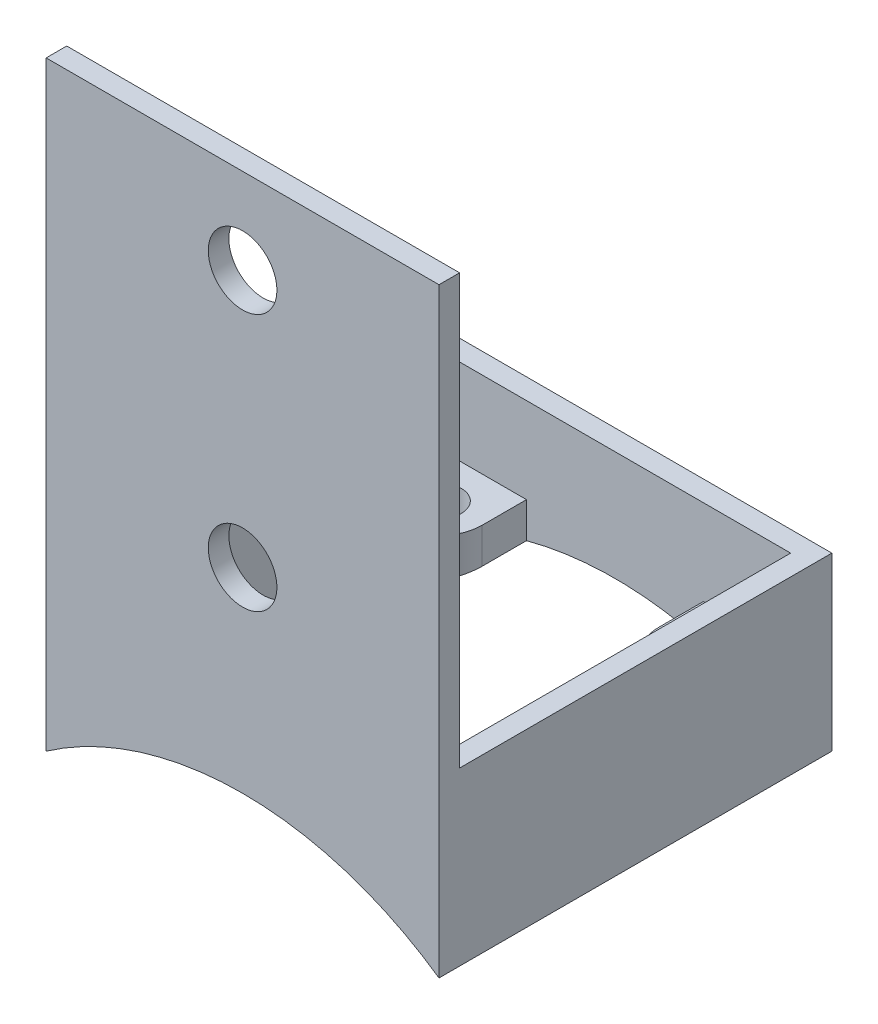
ISO-10303-21;
HEADER;
FILE_DESCRIPTION(('STEP AP214'),'2;1');
FILE_NAME('part.step','',(''),(''),'','','');
FILE_SCHEMA(('AUTOMOTIVE_DESIGN { 1 0 10303 214 1 1 1 1 }'));
ENDSEC;
DATA;
#1=APPLICATION_CONTEXT('core data for automotive mechanical design processes');
#2=APPLICATION_PROTOCOL_DEFINITION('international standard','automotive_design',2000,#1);
#3=PRODUCT_CONTEXT('',#1,'mechanical');
#4=PRODUCT('Part','Part','',(#3));
#5=PRODUCT_RELATED_PRODUCT_CATEGORY('part','',(#4));
#6=PRODUCT_DEFINITION_FORMATION('','',#4);
#7=PRODUCT_DEFINITION_CONTEXT('part definition',#1,'design');
#8=PRODUCT_DEFINITION('design','',#6,#7);
#9=PRODUCT_DEFINITION_SHAPE('','',#8);
#10=(LENGTH_UNIT() NAMED_UNIT(*) SI_UNIT(.MILLI.,.METRE.));
#11=(NAMED_UNIT(*) PLANE_ANGLE_UNIT() SI_UNIT($,.RADIAN.));
#12=(NAMED_UNIT(*) SI_UNIT($,.STERADIAN.) SOLID_ANGLE_UNIT());
#13=UNCERTAINTY_MEASURE_WITH_UNIT(LENGTH_MEASURE(1.E-05),#10,'distance_accuracy_value','');
#14=(GEOMETRIC_REPRESENTATION_CONTEXT(3) GLOBAL_UNCERTAINTY_ASSIGNED_CONTEXT((#13)) GLOBAL_UNIT_ASSIGNED_CONTEXT((#10,
#11,#12)) REPRESENTATION_CONTEXT('',''));
#15=CARTESIAN_POINT('',(0.,0.,0.));
#16=DIRECTION('',(0.,0.,1.));
#17=DIRECTION('',(1.,0.,0.));
#18=AXIS2_PLACEMENT_3D('',#15,#16,#17);
#19=CARTESIAN_POINT('',(10.25,10.,0.));
#20=DIRECTION('',(1.,0.,0.));
#21=DIRECTION('',(0.,0.,-1.));
#22=AXIS2_PLACEMENT_3D('',#19,#20,#21);
#23=PLANE('',#22);
#24=DIRECTION('',(0.,-1.,0.));
#25=VECTOR('',#24,1.);
#26=CARTESIAN_POINT('',(10.25,5.,-5.17999999999993));
#27=LINE('',#26,#25);
#28=CARTESIAN_POINT('',(10.25,5.,-5.17999999999993));
#29=VERTEX_POINT('',#28);
#30=CARTESIAN_POINT('',(10.25,0.775650094111034,-5.17999999999994));
#31=VERTEX_POINT('',#30);
#32=EDGE_CURVE('E283',#29,#31,#27,.T.);
#33=ORIENTED_EDGE('',*,*,#32,.T.);
#34=DIRECTION('',(0.,0.,-1.));
#35=VECTOR('',#34,1.);
#36=CARTESIAN_POINT('',(10.25,0.775650094111034,11.451));
#37=LINE('',#36,#35);
#38=CARTESIAN_POINT('',(10.25,0.775650094111034,10.25));
#39=VERTEX_POINT('',#38);
#40=EDGE_CURVE('E242',#39,#31,#37,.T.);
#41=ORIENTED_EDGE('',*,*,#40,.F.);
#42=DIRECTION('',(0.,-1.,0.));
#43=VECTOR('',#42,1.);
#44=CARTESIAN_POINT('',(10.25,10.,10.25));
#45=LINE('',#44,#43);
#46=CARTESIAN_POINT('',(10.25,10.,10.25));
#47=VERTEX_POINT('',#46);
#48=EDGE_CURVE('E45',#47,#39,#45,.T.);
#49=ORIENTED_EDGE('',*,*,#48,.F.);
#50=DIRECTION('',(0.,0.,1.));
#51=VECTOR('',#50,1.);
#52=CARTESIAN_POINT('',(10.25,10.,0.));
#53=LINE('',#52,#51);
#54=CARTESIAN_POINT('',(10.25,10.,-10.25));
#55=VERTEX_POINT('',#54);
#56=EDGE_CURVE('E219',#55,#47,#53,.T.);
#57=ORIENTED_EDGE('',*,*,#56,.F.);
#58=DIRECTION('',(0.,-1.,0.));
#59=VECTOR('',#58,1.);
#60=CARTESIAN_POINT('',(10.25,10.,-10.25));
#61=LINE('',#60,#59);
#62=CARTESIAN_POINT('',(10.25,5.,-10.25));
#63=VERTEX_POINT('',#62);
#64=EDGE_CURVE('E197',#55,#63,#61,.T.);
#65=ORIENTED_EDGE('',*,*,#64,.T.);
#66=DIRECTION('',(0.,0.,1.));
#67=VECTOR('',#66,1.);
#68=CARTESIAN_POINT('',(10.25,5.,0.));
#69=LINE('',#68,#67);
#70=EDGE_CURVE('E268',#63,#29,#69,.T.);
#71=ORIENTED_EDGE('',*,*,#70,.T.);
#72=EDGE_LOOP('',(#33,#41,#49,#57,#65,#71));
#73=FACE_BOUND('',#72,.T.);
#74=ADVANCED_FACE('F36',(#73),#23,.F.);
#75=CARTESIAN_POINT('',(0.,10.,-10.25));
#76=DIRECTION('',(0.,0.,-1.));
#77=DIRECTION('',(-1.,0.,0.));
#78=AXIS2_PLACEMENT_3D('',#75,#76,#77);
#79=PLANE('',#78);
#80=DIRECTION('',(0.,-1.,0.));
#81=VECTOR('',#80,1.);
#82=CARTESIAN_POINT('',(-5.15,5.,-10.25));
#83=LINE('',#82,#81);
#84=CARTESIAN_POINT('',(-5.15,5.,-10.25));
#85=VERTEX_POINT('',#84);
#86=CARTESIAN_POINT('',(-5.15,2.92747156694182,-10.25));
#87=VERTEX_POINT('',#86);
#88=EDGE_CURVE('E307',#85,#87,#83,.T.);
#89=ORIENTED_EDGE('',*,*,#88,.T.);
#90=CARTESIAN_POINT('',(0.,-16.3980944014846,-10.25));
#91=DIRECTION('',(0.,0.,-1.));
#92=DIRECTION('',(-1.,0.,0.));
#93=AXIS2_PLACEMENT_3D('',#90,#91,#92);
#94=CIRCLE('',#93,20.);
#95=CARTESIAN_POINT('',(5.14999999999993,2.9274715669418,-10.25));
#96=VERTEX_POINT('',#95);
#97=EDGE_CURVE('E618',#96,#87,#94,.F.);
#98=ORIENTED_EDGE('',*,*,#97,.F.);
#99=DIRECTION('',(0.,-1.,0.));
#100=VECTOR('',#99,1.);
#101=CARTESIAN_POINT('',(5.14999999999993,5.,-10.25));
#102=LINE('',#101,#100);
#103=CARTESIAN_POINT('',(5.14999999999993,5.,-10.25));
#104=VERTEX_POINT('',#103);
#105=EDGE_CURVE('E280',#104,#96,#102,.T.);
#106=ORIENTED_EDGE('',*,*,#105,.F.);
#107=DIRECTION('',(1.,0.,0.));
#108=VECTOR('',#107,1.);
#109=CARTESIAN_POINT('',(0.,5.,-10.25));
#110=LINE('',#109,#108);
#111=EDGE_CURVE('E237',#104,#63,#110,.T.);
#112=ORIENTED_EDGE('',*,*,#111,.T.);
#113=ORIENTED_EDGE('',*,*,#64,.F.);
#114=DIRECTION('',(1.,0.,0.));
#115=VECTOR('',#114,1.);
#116=CARTESIAN_POINT('',(0.,10.,-10.25));
#117=LINE('',#116,#115);
#118=CARTESIAN_POINT('',(-10.25,10.,-10.25));
#119=VERTEX_POINT('',#118);
#120=EDGE_CURVE('E194',#119,#55,#117,.T.);
#121=ORIENTED_EDGE('',*,*,#120,.F.);
#122=DIRECTION('',(0.,-1.,0.));
#123=VECTOR('',#122,1.);
#124=CARTESIAN_POINT('',(-10.25,10.,-10.25));
#125=LINE('',#124,#123);
#126=CARTESIAN_POINT('',(-10.25,5.,-10.25));
#127=VERTEX_POINT('',#126);
#128=EDGE_CURVE('E200',#119,#127,#125,.T.);
#129=ORIENTED_EDGE('',*,*,#128,.T.);
#130=DIRECTION('',(1.,0.,0.));
#131=VECTOR('',#130,1.);
#132=CARTESIAN_POINT('',(0.,5.,-10.25));
#133=LINE('',#132,#131);
#134=EDGE_CURVE('E299',#127,#85,#133,.T.);
#135=ORIENTED_EDGE('',*,*,#134,.T.);
#136=EDGE_LOOP('',(#89,#98,#106,#112,#113,#121,#129,#135));
#137=FACE_BOUND('',#136,.T.);
#138=ADVANCED_FACE('F235',(#137),#79,.F.);
#139=CARTESIAN_POINT('',(0.,10.,10.25));
#140=DIRECTION('',(0.,0.,-1.));
#141=DIRECTION('',(-1.,0.,0.));
#142=AXIS2_PLACEMENT_3D('',#139,#140,#141);
#143=PLANE('',#142);
#144=CARTESIAN_POINT('',(0.,15.,10.25));
#145=DIRECTION('',(0.,0.,-1.));
#146=DIRECTION('',(-1.,0.,0.));
#147=AXIS2_PLACEMENT_3D('',#144,#145,#146);
#148=CIRCLE('',#147,2.);
#149=CARTESIAN_POINT('',(-2.,15.,10.25));
#150=VERTEX_POINT('',#149);
#151=EDGE_CURVE('E594',#150,#150,#148,.T.);
#152=ORIENTED_EDGE('',*,*,#151,.F.);
#153=EDGE_LOOP('',(#152));
#154=FACE_BOUND('',#153,.T.);
#155=CARTESIAN_POINT('',(0.,30.,10.25));
#156=DIRECTION('',(0.,0.,-1.));
#157=DIRECTION('',(-1.,0.,0.));
#158=AXIS2_PLACEMENT_3D('',#155,#156,#157);
#159=CIRCLE('',#158,2.);
#160=CARTESIAN_POINT('',(-2.,30.,10.25));
#161=VERTEX_POINT('',#160);
#162=EDGE_CURVE('E597',#161,#161,#159,.T.);
#163=ORIENTED_EDGE('',*,*,#162,.F.);
#164=EDGE_LOOP('',(#163));
#165=FACE_BOUND('',#164,.T.);
#166=CARTESIAN_POINT('',(0.,-16.3980944014846,10.25));
#167=DIRECTION('',(0.,0.,-1.));
#168=DIRECTION('',(-1.,0.,0.));
#169=AXIS2_PLACEMENT_3D('',#166,#167,#168);
#170=CIRCLE('',#169,20.);
#171=CARTESIAN_POINT('',(-10.25,0.775650094111038,10.25));
#172=VERTEX_POINT('',#171);
#173=EDGE_CURVE('E631',#39,#172,#170,.F.);
#174=ORIENTED_EDGE('',*,*,#173,.T.);
#175=DIRECTION('',(0.,-1.,0.));
#176=VECTOR('',#175,1.);
#177=CARTESIAN_POINT('',(-10.25,10.,10.25));
#178=LINE('',#177,#176);
#179=CARTESIAN_POINT('',(-10.25,10.,10.25));
#180=VERTEX_POINT('',#179);
#181=EDGE_CURVE('E203',#180,#172,#178,.T.);
#182=ORIENTED_EDGE('',*,*,#181,.F.);
#183=DIRECTION('',(-1.,0.,0.));
#184=VECTOR('',#183,1.);
#185=CARTESIAN_POINT('',(-11.45,10.,10.25));
#186=LINE('',#185,#184);
#187=CARTESIAN_POINT('',(-11.45,10.,10.25));
#188=VERTEX_POINT('',#187);
#189=EDGE_CURVE('E11',#180,#188,#186,.T.);
#190=ORIENTED_EDGE('',*,*,#189,.T.);
#191=DIRECTION('',(0.,-1.,0.));
#192=VECTOR('',#191,1.);
#193=CARTESIAN_POINT('',(-11.45,35.,10.25));
#194=LINE('',#193,#192);
#195=CARTESIAN_POINT('',(-11.45,35.,10.25));
#196=VERTEX_POINT('',#195);
#197=EDGE_CURVE('E218',#196,#188,#194,.T.);
#198=ORIENTED_EDGE('',*,*,#197,.F.);
#199=DIRECTION('',(-1.,0.,0.));
#200=VECTOR('',#199,1.);
#201=CARTESIAN_POINT('',(-11.45,35.,10.25));
#202=LINE('',#201,#200);
#203=CARTESIAN_POINT('',(11.45,35.,10.25));
#204=VERTEX_POINT('',#203);
#205=EDGE_CURVE('E258',#204,#196,#202,.T.);
#206=ORIENTED_EDGE('',*,*,#205,.F.);
#207=DIRECTION('',(0.,-1.,0.));
#208=VECTOR('',#207,1.);
#209=CARTESIAN_POINT('',(11.45,35.,10.25));
#210=LINE('',#209,#208);
#211=CARTESIAN_POINT('',(11.45,10.,10.25));
#212=VERTEX_POINT('',#211);
#213=EDGE_CURVE('E249',#204,#212,#210,.T.);
#214=ORIENTED_EDGE('',*,*,#213,.T.);
#215=EDGE_CURVE('E47',#212,#47,#186,.T.);
#216=ORIENTED_EDGE('',*,*,#215,.T.);
#217=ORIENTED_EDGE('',*,*,#48,.T.);
#218=EDGE_LOOP('',(#174,#182,#190,#198,#206,#214,#216,#217));
#219=FACE_BOUND('',#218,.T.);
#220=ADVANCED_FACE('F246',(#154,#165,#219),#143,.T.);
#221=CARTESIAN_POINT('',(-10.25,10.,0.));
#222=DIRECTION('',(1.,0.,0.));
#223=DIRECTION('',(0.,0.,-1.));
#224=AXIS2_PLACEMENT_3D('',#221,#222,#223);
#225=PLANE('',#224);
#226=DIRECTION('',(0.,0.,-1.));
#227=VECTOR('',#226,1.);
#228=CARTESIAN_POINT('',(-10.25,0.775650094111038,11.451));
#229=LINE('',#228,#227);
#230=CARTESIAN_POINT('',(-10.25,0.775650094111034,-5.17999999999994));
#231=VERTEX_POINT('',#230);
#232=EDGE_CURVE('E325',#172,#231,#229,.T.);
#233=ORIENTED_EDGE('',*,*,#232,.T.);
#234=DIRECTION('',(0.,-1.,0.));
#235=VECTOR('',#234,1.);
#236=CARTESIAN_POINT('',(-10.25,5.,-5.17999999999993));
#237=LINE('',#236,#235);
#238=CARTESIAN_POINT('',(-10.25,5.,-5.17999999999993));
#239=VERTEX_POINT('',#238);
#240=EDGE_CURVE('E304',#239,#231,#237,.T.);
#241=ORIENTED_EDGE('',*,*,#240,.F.);
#242=DIRECTION('',(0.,0.,1.));
#243=VECTOR('',#242,1.);
#244=CARTESIAN_POINT('',(-10.25,5.,0.));
#245=LINE('',#244,#243);
#246=EDGE_CURVE('E302',#127,#239,#245,.T.);
#247=ORIENTED_EDGE('',*,*,#246,.F.);
#248=ORIENTED_EDGE('',*,*,#128,.F.);
#249=DIRECTION('',(0.,0.,1.));
#250=VECTOR('',#249,1.);
#251=CARTESIAN_POINT('',(-10.25,10.,0.));
#252=LINE('',#251,#250);
#253=EDGE_CURVE('E225',#119,#180,#252,.T.);
#254=ORIENTED_EDGE('',*,*,#253,.T.);
#255=ORIENTED_EDGE('',*,*,#181,.T.);
#256=EDGE_LOOP('',(#233,#241,#247,#248,#254,#255));
#257=FACE_BOUND('',#256,.T.);
#258=ADVANCED_FACE('F362',(#257),#225,.T.);
#259=CARTESIAN_POINT('',(0.,10.,11.45));
#260=DIRECTION('',(0.,0.,-1.));
#261=DIRECTION('',(-1.,0.,0.));
#262=AXIS2_PLACEMENT_3D('',#259,#260,#261);
#263=PLANE('',#262);
#264=CARTESIAN_POINT('',(0.,15.,11.45));
#265=DIRECTION('',(0.,0.,-1.));
#266=DIRECTION('',(-1.,0.,0.));
#267=AXIS2_PLACEMENT_3D('',#264,#265,#266);
#268=CIRCLE('',#267,2.);
#269=CARTESIAN_POINT('',(-2.,15.,11.45));
#270=VERTEX_POINT('',#269);
#271=EDGE_CURVE('E351',#270,#270,#268,.T.);
#272=ORIENTED_EDGE('',*,*,#271,.T.);
#273=EDGE_LOOP('',(#272));
#274=FACE_BOUND('',#273,.T.);
#275=CARTESIAN_POINT('',(0.,30.,11.45));
#276=DIRECTION('',(0.,0.,-1.));
#277=DIRECTION('',(-1.,0.,0.));
#278=AXIS2_PLACEMENT_3D('',#275,#276,#277);
#279=CIRCLE('',#278,2.);
#280=CARTESIAN_POINT('',(-2.,30.,11.45));
#281=VERTEX_POINT('',#280);
#282=EDGE_CURVE('E599',#281,#281,#279,.T.);
#283=ORIENTED_EDGE('',*,*,#282,.T.);
#284=EDGE_LOOP('',(#283));
#285=FACE_BOUND('',#284,.T.);
#286=DIRECTION('',(0.,-1.,0.));
#287=VECTOR('',#286,1.);
#288=CARTESIAN_POINT('',(-11.45,10.,11.45));
#289=LINE('',#288,#287);
#290=CARTESIAN_POINT('',(-11.45,35.,11.45));
#291=VERTEX_POINT('',#290);
#292=CARTESIAN_POINT('',(-11.45,0.,11.45));
#293=VERTEX_POINT('',#292);
#294=EDGE_CURVE('E208',#291,#293,#289,.T.);
#295=ORIENTED_EDGE('',*,*,#294,.T.);
#296=CARTESIAN_POINT('',(0.,-16.3980944014846,11.45));
#297=DIRECTION('',(0.,0.,-1.));
#298=DIRECTION('',(-1.,0.,0.));
#299=AXIS2_PLACEMENT_3D('',#296,#297,#298);
#300=CIRCLE('',#299,20.);
#301=CARTESIAN_POINT('',(11.45,0.,11.45));
#302=VERTEX_POINT('',#301);
#303=EDGE_CURVE('E251',#302,#293,#300,.F.);
#304=ORIENTED_EDGE('',*,*,#303,.F.);
#305=DIRECTION('',(0.,-1.,0.));
#306=VECTOR('',#305,1.);
#307=CARTESIAN_POINT('',(11.45,10.,11.45));
#308=LINE('',#307,#306);
#309=CARTESIAN_POINT('',(11.45,35.,11.45));
#310=VERTEX_POINT('',#309);
#311=EDGE_CURVE('E40',#310,#302,#308,.T.);
#312=ORIENTED_EDGE('',*,*,#311,.F.);
#313=DIRECTION('',(1.,0.,0.));
#314=VECTOR('',#313,1.);
#315=CARTESIAN_POINT('',(-11.45,35.,11.45));
#316=LINE('',#315,#314);
#317=EDGE_CURVE('E253',#291,#310,#316,.T.);
#318=ORIENTED_EDGE('',*,*,#317,.F.);
#319=EDGE_LOOP('',(#295,#304,#312,#318));
#320=FACE_BOUND('',#319,.T.);
#321=ADVANCED_FACE('F38',(#274,#285,#320),#263,.F.);
#322=CARTESIAN_POINT('',(11.45,10.,0.));
#323=DIRECTION('',(1.,0.,0.));
#324=DIRECTION('',(0.,0.,-1.));
#325=AXIS2_PLACEMENT_3D('',#322,#323,#324);
#326=PLANE('',#325);
#327=DIRECTION('',(0.,0.,1.));
#328=VECTOR('',#327,1.);
#329=CARTESIAN_POINT('',(11.45,10.,0.));
#330=LINE('',#329,#328);
#331=CARTESIAN_POINT('',(11.45,10.,-11.45));
#332=VERTEX_POINT('',#331);
#333=EDGE_CURVE('E188',#332,#212,#330,.T.);
#334=ORIENTED_EDGE('',*,*,#333,.T.);
#335=ORIENTED_EDGE('',*,*,#213,.F.);
#336=DIRECTION('',(0.,0.,-1.));
#337=VECTOR('',#336,1.);
#338=CARTESIAN_POINT('',(11.45,35.,10.25));
#339=LINE('',#338,#337);
#340=EDGE_CURVE('E355',#310,#204,#339,.T.);
#341=ORIENTED_EDGE('',*,*,#340,.F.);
#342=ORIENTED_EDGE('',*,*,#311,.T.);
#343=DIRECTION('',(0.,0.,1.));
#344=VECTOR('',#343,1.);
#345=CARTESIAN_POINT('',(11.45,0.,0.));
#346=LINE('',#345,#344);
#347=CARTESIAN_POINT('',(11.45,0.,-11.45));
#348=VERTEX_POINT('',#347);
#349=EDGE_CURVE('E167',#348,#302,#346,.T.);
#350=ORIENTED_EDGE('',*,*,#349,.F.);
#351=DIRECTION('',(0.,-1.,0.));
#352=VECTOR('',#351,1.);
#353=CARTESIAN_POINT('',(11.45,10.,-11.45));
#354=LINE('',#353,#352);
#355=EDGE_CURVE('E177',#332,#348,#354,.T.);
#356=ORIENTED_EDGE('',*,*,#355,.F.);
#357=EDGE_LOOP('',(#334,#335,#341,#342,#350,#356));
#358=FACE_BOUND('',#357,.T.);
#359=ADVANCED_FACE('F184',(#358),#326,.T.);
#360=CARTESIAN_POINT('',(0.,10.,-11.45));
#361=DIRECTION('',(0.,0.,-1.));
#362=DIRECTION('',(-1.,0.,0.));
#363=AXIS2_PLACEMENT_3D('',#360,#361,#362);
#364=PLANE('',#363);
#365=CARTESIAN_POINT('',(0.,-16.3980944014846,-11.45));
#366=DIRECTION('',(0.,0.,-1.));
#367=DIRECTION('',(-1.,0.,0.));
#368=AXIS2_PLACEMENT_3D('',#365,#366,#367);
#369=CIRCLE('',#368,20.);
#370=CARTESIAN_POINT('',(-11.45,0.,-11.45));
#371=VERTEX_POINT('',#370);
#372=EDGE_CURVE('E163',#371,#348,#369,.T.);
#373=ORIENTED_EDGE('',*,*,#372,.F.);
#374=DIRECTION('',(0.,-1.,0.));
#375=VECTOR('',#374,1.);
#376=CARTESIAN_POINT('',(-11.45,10.,-11.45));
#377=LINE('',#376,#375);
#378=CARTESIAN_POINT('',(-11.45,10.,-11.45));
#379=VERTEX_POINT('',#378);
#380=EDGE_CURVE('E182',#379,#371,#377,.T.);
#381=ORIENTED_EDGE('',*,*,#380,.F.);
#382=DIRECTION('',(1.,0.,0.));
#383=VECTOR('',#382,1.);
#384=CARTESIAN_POINT('',(0.,10.,-11.45));
#385=LINE('',#384,#383);
#386=EDGE_CURVE('E180',#379,#332,#385,.T.);
#387=ORIENTED_EDGE('',*,*,#386,.T.);
#388=ORIENTED_EDGE('',*,*,#355,.T.);
#389=EDGE_LOOP('',(#373,#381,#387,#388));
#390=FACE_BOUND('',#389,.T.);
#391=ADVANCED_FACE('F178',(#390),#364,.T.);
#392=CARTESIAN_POINT('',(-11.45,10.,0.));
#393=DIRECTION('',(1.,0.,0.));
#394=DIRECTION('',(0.,0.,-1.));
#395=AXIS2_PLACEMENT_3D('',#392,#393,#394);
#396=PLANE('',#395);
#397=DIRECTION('',(0.,0.,1.));
#398=VECTOR('',#397,1.);
#399=CARTESIAN_POINT('',(-11.45,0.,0.));
#400=LINE('',#399,#398);
#401=EDGE_CURVE('E170',#371,#293,#400,.T.);
#402=ORIENTED_EDGE('',*,*,#401,.T.);
#403=ORIENTED_EDGE('',*,*,#294,.F.);
#404=DIRECTION('',(0.,0.,1.));
#405=VECTOR('',#404,1.);
#406=CARTESIAN_POINT('',(-11.45,35.,10.25));
#407=LINE('',#406,#405);
#408=EDGE_CURVE('E250',#196,#291,#407,.T.);
#409=ORIENTED_EDGE('',*,*,#408,.F.);
#410=ORIENTED_EDGE('',*,*,#197,.T.);
#411=DIRECTION('',(0.,0.,1.));
#412=VECTOR('',#411,1.);
#413=CARTESIAN_POINT('',(-11.45,10.,0.));
#414=LINE('',#413,#412);
#415=EDGE_CURVE('E215',#379,#188,#414,.T.);
#416=ORIENTED_EDGE('',*,*,#415,.F.);
#417=ORIENTED_EDGE('',*,*,#380,.T.);
#418=EDGE_LOOP('',(#402,#403,#409,#410,#416,#417));
#419=FACE_BOUND('',#418,.T.);
#420=ADVANCED_FACE('F213',(#419),#396,.F.);
#421=CARTESIAN_POINT('',(0.,10.,0.));
#422=DIRECTION('',(0.,1.,0.));
#423=DIRECTION('',(0.,0.,1.));
#424=AXIS2_PLACEMENT_3D('',#421,#422,#423);
#425=PLANE('',#424);
#426=ORIENTED_EDGE('',*,*,#215,.F.);
#427=ORIENTED_EDGE('',*,*,#333,.F.);
#428=ORIENTED_EDGE('',*,*,#386,.F.);
#429=ORIENTED_EDGE('',*,*,#415,.T.);
#430=ORIENTED_EDGE('',*,*,#189,.F.);
#431=ORIENTED_EDGE('',*,*,#253,.F.);
#432=ORIENTED_EDGE('',*,*,#120,.T.);
#433=ORIENTED_EDGE('',*,*,#56,.T.);
#434=EDGE_LOOP('',(#426,#427,#428,#429,#430,#431,#432,#433));
#435=FACE_BOUND('',#434,.T.);
#436=ADVANCED_FACE('F221',(#435),#425,.T.);
#437=CARTESIAN_POINT('',(0.,5.,-5.17999999999993));
#438=DIRECTION('',(0.,0.,1.));
#439=DIRECTION('',(1.,0.,0.));
#440=AXIS2_PLACEMENT_3D('',#437,#438,#439);
#441=PLANE('',#440);
#442=CARTESIAN_POINT('',(0.,-16.3980944014846,-5.17999999999994));
#443=DIRECTION('',(0.,0.,1.));
#444=DIRECTION('',(1.,0.,0.));
#445=AXIS2_PLACEMENT_3D('',#442,#443,#444);
#446=CIRCLE('',#445,20.);
#447=CARTESIAN_POINT('',(-7.62,2.09340634886018,-5.17999999999993));
#448=VERTEX_POINT('',#447);
#449=EDGE_CURVE('E323',#231,#448,#446,.F.);
#450=ORIENTED_EDGE('',*,*,#449,.T.);
#451=DIRECTION('',(0.,-1.,0.));
#452=VECTOR('',#451,1.);
#453=CARTESIAN_POINT('',(-7.62,5.,-5.17999999999993));
#454=LINE('',#453,#452);
#455=CARTESIAN_POINT('',(-7.62,5.,-5.17999999999993));
#456=VERTEX_POINT('',#455);
#457=EDGE_CURVE('E186',#456,#448,#454,.T.);
#458=ORIENTED_EDGE('',*,*,#457,.F.);
#459=DIRECTION('',(-1.,0.,0.));
#460=VECTOR('',#459,1.);
#461=CARTESIAN_POINT('',(0.,5.,-5.17999999999993));
#462=LINE('',#461,#460);
#463=EDGE_CURVE('E291',#456,#239,#462,.T.);
#464=ORIENTED_EDGE('',*,*,#463,.T.);
#465=ORIENTED_EDGE('',*,*,#240,.T.);
#466=EDGE_LOOP('',(#450,#458,#464,#465));
#467=FACE_BOUND('',#466,.T.);
#468=ADVANCED_FACE('F397',(#467),#441,.T.);
#469=CARTESIAN_POINT('',(-7.62,5.,-7.64999999999993));
#470=DIRECTION('',(0.,-1.,0.));
#471=DIRECTION('',(0.,0.,-1.));
#472=AXIS2_PLACEMENT_3D('',#469,#470,#471);
#473=CYLINDRICAL_SURFACE('',#472,2.47);
#474=ORIENTED_EDGE('',*,*,#457,.T.);
#475=CARTESIAN_POINT('',(-5.15,2.92747156694182,-7.64999999999993));
#476=CARTESIAN_POINT('',(-5.14999223558399,2.92747097260264,-7.58247948906051));
#477=CARTESIAN_POINT('',(-5.15276855248304,2.92673371624351,-7.514962452327));
#478=CARTESIAN_POINT('',(-5.16382977522235,2.9237823720544,-7.38041923995242));
#479=CARTESIAN_POINT('',(-5.17211420936993,2.92156841068337,-7.31339302277643));
#480=CARTESIAN_POINT('',(-5.19411670710465,2.91566428386935,-7.18039675118935));
#481=CARTESIAN_POINT('',(-5.20782715122338,2.91197618840545,-7.11442535013461));
#482=CARTESIAN_POINT('',(-5.24054955511454,2.90312123693403,-6.98393151999905));
#483=CARTESIAN_POINT('',(-5.25956148358291,2.89795438965819,-6.91940908236487));
#484=CARTESIAN_POINT('',(-5.3243477830406,2.88021871576205,-6.72865851647103));
#485=CARTESIAN_POINT('',(-5.37788587042126,2.86541132037174,-6.60516812217229));
#486=CARTESIAN_POINT('',(-5.50377080002298,2.82982162368435,-6.36922584477822));
#487=CARTESIAN_POINT('',(-5.57611740068517,2.80903939912199,-6.25677381994199));
#488=CARTESIAN_POINT('',(-5.73798934559608,2.76130654854392,-6.04473263800879));
#489=CARTESIAN_POINT('',(-5.82767102353969,2.73429932072138,-5.94527550900525));
#490=CARTESIAN_POINT('',(-6.02080272504163,2.67440252955053,-5.76290744558526));
#491=CARTESIAN_POINT('',(-6.12425394921658,2.64151245316925,-5.67999795559488));
#492=CARTESIAN_POINT('',(-6.34504988447819,2.56909383232979,-5.530153735974));
#493=CARTESIAN_POINT('',(-6.46272448899574,2.5293919552003,-5.46378999426301));
#494=CARTESIAN_POINT('',(-6.70572857344134,2.44467002190433,-5.35153685144533));
#495=CARTESIAN_POINT('',(-6.83106168845243,2.39964743066173,-5.30565726024036));
#496=CARTESIAN_POINT('',(-7.06713184792431,2.31203795246037,-5.24002598106749));
#497=CARTESIAN_POINT('',(-7.17732058462541,2.27005891712165,-5.21743312821896));
#498=CARTESIAN_POINT('',(-7.39849039126159,2.18352722446204,-5.18742102553309));
#499=CARTESIAN_POINT('',(-7.50946935780649,2.13898005484746,-5.1799705705591));
#500=CARTESIAN_POINT('',(-7.62,2.09340634886018,-5.17999999999993));
#501=B_SPLINE_CURVE_WITH_KNOTS('',3,(#475,#476,#477,#478,#479,#480,#481,#482,#483,#484,#485,
#486,#487,#488,#489,#490,#491,#492,#493,#494,#495,#496,#497,#498,#499,#500),.UNSPECIFIED.,.F.,
.F.,(4,2,2,2,2,2,2,2,2,2,2,2,4),(0.,0.202494294076473,0.404971249600714,0.607164880253024,
0.809357317023037,1.21350467888923,1.61764685052284,2.02561980477335,2.43362835499596,
2.85420964599396,3.27499213875499,3.63419277828845,3.99265243101245),.UNSPECIFIED.);
#502=CARTESIAN_POINT('',(-5.15,2.92747156694182,-7.64999999999993));
#503=VERTEX_POINT('',#502);
#504=EDGE_CURVE('E321',#503,#448,#501,.T.);
#505=ORIENTED_EDGE('',*,*,#504,.F.);
#506=DIRECTION('',(0.,-1.,0.));
#507=VECTOR('',#506,1.);
#508=CARTESIAN_POINT('',(-5.15,5.,-7.64999999999993));
#509=LINE('',#508,#507);
#510=CARTESIAN_POINT('',(-5.15,5.,-7.64999999999993));
#511=VERTEX_POINT('',#510);
#512=EDGE_CURVE('E191',#511,#503,#509,.T.);
#513=ORIENTED_EDGE('',*,*,#512,.F.);
#514=CARTESIAN_POINT('',(-7.62,5.,-7.64999999999993));
#515=DIRECTION('',(0.,1.,0.));
#516=DIRECTION('',(0.,0.,1.));
#517=AXIS2_PLACEMENT_3D('',#514,#515,#516);
#518=CIRCLE('',#517,2.47);
#519=EDGE_CURVE('E294',#456,#511,#518,.T.);
#520=ORIENTED_EDGE('',*,*,#519,.F.);
#521=EDGE_LOOP('',(#474,#505,#513,#520));
#522=FACE_BOUND('',#521,.T.);
#523=ADVANCED_FACE('F319',(#522),#473,.T.);
#524=CARTESIAN_POINT('',(-5.15,5.,0.));
#525=DIRECTION('',(-1.,0.,0.));
#526=DIRECTION('',(0.,0.,1.));
#527=AXIS2_PLACEMENT_3D('',#524,#525,#526);
#528=PLANE('',#527);
#529=ORIENTED_EDGE('',*,*,#512,.T.);
#530=DIRECTION('',(0.,0.,-1.));
#531=VECTOR('',#530,1.);
#532=CARTESIAN_POINT('',(-5.15,2.92747156694182,11.451));
#533=LINE('',#532,#531);
#534=EDGE_CURVE('E315',#87,#503,#533,.F.);
#535=ORIENTED_EDGE('',*,*,#534,.F.);
#536=ORIENTED_EDGE('',*,*,#88,.F.);
#537=DIRECTION('',(0.,0.,-1.));
#538=VECTOR('',#537,1.);
#539=CARTESIAN_POINT('',(-5.15,5.,0.));
#540=LINE('',#539,#538);
#541=EDGE_CURVE('E297',#511,#85,#540,.T.);
#542=ORIENTED_EDGE('',*,*,#541,.F.);
#543=EDGE_LOOP('',(#529,#535,#536,#542));
#544=FACE_BOUND('',#543,.T.);
#545=ADVANCED_FACE('F313',(#544),#528,.F.);
#546=CARTESIAN_POINT('',(-7.62,5.,-7.64999999999993));
#547=DIRECTION('',(0.,-1.,0.));
#548=DIRECTION('',(0.,0.,-1.));
#549=AXIS2_PLACEMENT_3D('',#546,#547,#548);
#550=CYLINDRICAL_SURFACE('',#549,1.27);
#551=CARTESIAN_POINT('',(-7.62,2.09340634886018,-8.91999999999993));
#552=CARTESIAN_POINT('',(-7.54551005576193,2.12410156057715,-8.9199974953949));
#553=CARTESIAN_POINT('',(-7.47078402826356,2.15436365017218,-8.91343342922747));
#554=CARTESIAN_POINT('',(-7.32294728682843,2.21321368813076,-8.8870553774894));
#555=CARTESIAN_POINT('',(-7.24983827154692,2.2417999236233,-8.86722808395438));
#556=CARTESIAN_POINT('',(-7.10735914683395,2.29659152157832,-8.81442252263176));
#557=CARTESIAN_POINT('',(-7.03799683356895,2.32279199190798,-8.78141794817381));
#558=CARTESIAN_POINT('',(-6.90557710915887,2.37204140645782,-8.70281635296973));
#559=CARTESIAN_POINT('',(-6.84251687830173,2.39509176183145,-8.65722499853607));
#560=CARTESIAN_POINT('',(-6.7280048975102,2.43638142931441,-8.55705219025803));
#561=CARTESIAN_POINT('',(-6.67613380089649,2.45480205093276,-8.50302554842141));
#562=CARTESIAN_POINT('',(-6.58226665194645,2.48777989239738,-8.38595627621547));
#563=CARTESIAN_POINT('',(-6.54026707896943,2.50233848985865,-8.32291687315234));
#564=CARTESIAN_POINT('',(-6.4701742576286,2.52644357447923,-8.1939193658565));
#565=CARTESIAN_POINT('',(-6.44137298780643,2.53624753222151,-8.12839360528765));
#566=CARTESIAN_POINT('',(-6.39511045638186,2.55192313937463,-7.9930126087371));
#567=CARTESIAN_POINT('',(-6.37764588600092,2.55779593616688,-7.92315864253064));
#568=CARTESIAN_POINT('',(-6.35525794083915,2.56531325539668,-7.7843683170633));
#569=CARTESIAN_POINT('',(-6.34982445880683,2.5671297897577,-7.71552310908807));
#570=CARTESIAN_POINT('',(-6.35018413447212,2.56700940142509,-7.57786975584314));
#571=CARTESIAN_POINT('',(-6.35597583120923,2.5650729671815,-7.50906160691605));
#572=CARTESIAN_POINT('',(-6.37838905493678,2.55754558301952,-7.37453265267393));
#573=CARTESIAN_POINT('',(-6.39484361830521,2.55201097061106,-7.30878072620506));
#574=CARTESIAN_POINT('',(-6.43782193641722,2.53745311467859,-7.18107060311658));
#575=CARTESIAN_POINT('',(-6.46434587681343,2.52842980683222,-7.11911247646904));
#576=CARTESIAN_POINT('',(-6.52694072274954,2.50693531722736,-6.9998334184839));
#577=CARTESIAN_POINT('',(-6.56313083628225,2.4944209904163,-6.94258294550982));
#578=CARTESIAN_POINT('',(-6.64366636976325,2.46625061054662,-6.83502209939447));
#579=CARTESIAN_POINT('',(-6.68801294582619,2.45059411208106,-6.78471271186911));
#580=CARTESIAN_POINT('',(-6.78530064445859,2.41579565025428,-6.69034191994612));
#581=CARTESIAN_POINT('',(-6.83850630421955,2.39654297623719,-6.64659442415774));
#582=CARTESIAN_POINT('',(-6.95055505682083,2.35539449604999,-6.56860892683976));
#583=CARTESIAN_POINT('',(-7.00939949779862,2.33349805747338,-6.53437320708264));
#584=CARTESIAN_POINT('',(-7.13456019828695,2.28619769593389,-6.47427120330848));
#585=CARTESIAN_POINT('',(-7.20111133294163,2.26066476382696,-6.44899594291999));
#586=CARTESIAN_POINT('',(-7.33679457536261,2.20773138733922,-6.40996659547856));
#587=CARTESIAN_POINT('',(-7.4059274471584,2.18033038811716,-6.39621594765453));
#588=CARTESIAN_POINT('',(-7.54933180412263,2.12254065530196,-6.37979091222887));
#589=CARTESIAN_POINT('',(-7.62365612595467,2.09207201288535,-6.37785614972721));
#590=CARTESIAN_POINT('',(-7.771268899007,2.03051873439399,-6.38687300895872));
#591=CARTESIAN_POINT('',(-7.84455704087968,1.99943392074978,-6.39782840008368));
#592=CARTESIAN_POINT('',(-7.99126500741116,1.93619931946364,-6.43304104929278));
#593=CARTESIAN_POINT('',(-8.06456021335362,1.90405985983082,-6.45783944332806));
#594=CARTESIAN_POINT('',(-8.2059357797909,1.84111091971234,-6.52059255028748));
#595=CARTESIAN_POINT('',(-8.27401540580105,1.81030162681321,-6.55854911206899));
#596=CARTESIAN_POINT('',(-8.40228548066908,1.751465907605,-6.64654272491312));
#597=CARTESIAN_POINT('',(-8.46253789536169,1.72341811110336,-6.69647467717201));
#598=CARTESIAN_POINT('',(-8.57362304074189,1.67112699054153,-6.80758381524257));
#599=CARTESIAN_POINT('',(-8.62445991047536,1.64688199550222,-6.86875603619309));
#600=CARTESIAN_POINT('',(-8.7111559370569,1.6051806838087,-6.99596412353873));
#601=CARTESIAN_POINT('',(-8.74783914676629,1.58735731182544,-7.06131604812851));
#602=CARTESIAN_POINT('',(-8.80941739204466,1.55727667552654,-7.19852908083078));
#603=CARTESIAN_POINT('',(-8.83432268393986,1.54501456878935,-7.27038446045668));
#604=CARTESIAN_POINT('',(-8.86908339600598,1.52785596128458,-7.41051055207552));
#605=CARTESIAN_POINT('',(-8.88022638842646,1.52233008398683,-7.47838629593601));
#606=CARTESIAN_POINT('',(-8.89137746701258,1.51680023328184,-7.61525982240718));
#607=CARTESIAN_POINT('',(-8.89139040596062,1.51679385333452,-7.68425710289741));
#608=CARTESIAN_POINT('',(-8.88064523868174,1.52212233838711,-7.8167744259816));
#609=CARTESIAN_POINT('',(-8.87056772657096,1.52711970397189,-7.88036506368928));
#610=CARTESIAN_POINT('',(-8.84110829922172,1.54166789579751,-8.00479954868465));
#611=CARTESIAN_POINT('',(-8.82172614230888,1.55121884031077,-8.06564332458175));
#612=CARTESIAN_POINT('',(-8.77406599639867,1.57456472782395,-8.18401159293867));
#613=CARTESIAN_POINT('',(-8.74565150579419,1.58842471578024,-8.24146795360407));
#614=CARTESIAN_POINT('',(-8.68106494147277,1.61968558383851,-8.35076700215643));
#615=CARTESIAN_POINT('',(-8.64489098179167,1.63708732472231,-8.40260832067091));
#616=CARTESIAN_POINT('',(-8.56280866392422,1.67621132007319,-8.50356162968377));
#617=CARTESIAN_POINT('',(-8.51636083757247,1.69816480737114,-8.55214462228624));
#618=CARTESIAN_POINT('',(-8.4171108078294,1.74454176513472,-8.64093588102263));
#619=CARTESIAN_POINT('',(-8.36430456556477,1.76896680394385,-8.68113877936422));
#620=CARTESIAN_POINT('',(-8.24830317950116,1.821947845732,-8.75605301004081));
#621=CARTESIAN_POINT('',(-8.18459715704758,1.85067469758625,-8.78985253017839));
#622=CARTESIAN_POINT('',(-8.05287057752333,1.90918444752779,-8.84609655379575));
#623=CARTESIAN_POINT('',(-7.98485309765287,1.93896658588096,-8.86854905549255));
#624=CARTESIAN_POINT('',(-7.86719041656804,1.98967585987437,-8.89670295919479));
#625=CARTESIAN_POINT('',(-7.81822249841123,2.01055200759388,-8.90541852924766));
#626=CARTESIAN_POINT('',(-7.71953828443805,2.0521521442611,-8.91706804480496));
#627=CARTESIAN_POINT('',(-7.6698219479803,2.07287612485411,-8.92000167518311));
#628=CARTESIAN_POINT('',(-7.62,2.09340634886018,-8.91999999999993));
#629=B_SPLINE_CURVE_WITH_KNOTS('',3,(#551,#552,#553,#554,#555,#556,#557,#558,#559,#560,#561,
#562,#563,#564,#565,#566,#567,#568,#569,#570,#571,#572,#573,#574,#575,#576,#577,#578,#579,#580,
#581,#582,#583,#584,#585,#586,#587,#588,#589,#590,#591,#592,#593,#594,#595,#596,#597,#598,#599,
#600,#601,#602,#603,#604,#605,#606,#607,#608,#609,#610,#611,#612,#613,#614,#615,#616,#617,#618,
#619,#620,#621,#622,#623,#624,#625,#626,#627,#628),.UNSPECIFIED.,.T.,.F.,(4,2,2,2,2,2,2,2,2,2,2,
2,2,2,2,2,2,2,2,2,2,2,2,2,2,2,2,2,2,2,2,2,2,2,2,2,2,2,4),(0.,0.241513322809551,
0.483269337776195,0.725510418913045,0.967642625363926,1.19782351837005,1.4279221932595,
1.64356150239259,1.85913784576453,2.06538329810636,2.27160190934118,2.47466703499856,
2.67773590482079,2.88343504195339,3.08916335782765,3.30278760911329,3.51646306239209,
3.74236558806747,3.96833550465365,4.20831625398783,4.4483671969252,4.69853484919766,
4.94873766684521,5.19682020432366,5.4447934252523,5.67461235947347,5.90423079491223,
6.11016018843005,6.3159997952235,6.50883194931457,6.70166911220649,6.89757140498512,
7.09352136651294,7.30476824203516,7.5161500167924,7.74804951811319,7.97978533074542,
8.14131060211326,8.30284467666044),.UNSPECIFIED.);
#630=CARTESIAN_POINT('',(-7.62,2.09340634886018,-8.91999999999993));
#631=VERTEX_POINT('',#630);
#632=EDGE_CURVE('E174',#631,#631,#629,.T.);
#633=ORIENTED_EDGE('',*,*,#632,.T.);
#634=EDGE_LOOP('',(#633));
#635=FACE_BOUND('',#634,.T.);
#636=CARTESIAN_POINT('',(-7.62,5.,-7.64999999999993));
#637=DIRECTION('',(0.,1.,0.));
#638=DIRECTION('',(0.,0.,1.));
#639=AXIS2_PLACEMENT_3D('',#636,#637,#638);
#640=CIRCLE('',#639,1.27);
#641=CARTESIAN_POINT('',(-7.62,5.,-6.37999999999994));
#642=VERTEX_POINT('',#641);
#643=EDGE_CURVE('E288',#642,#642,#640,.T.);
#644=ORIENTED_EDGE('',*,*,#643,.T.);
#645=EDGE_LOOP('',(#644));
#646=FACE_BOUND('',#645,.T.);
#647=ADVANCED_FACE('F418',(#635,#646),#550,.F.);
#648=CARTESIAN_POINT('',(0.,5.,0.));
#649=DIRECTION('',(0.,1.,0.));
#650=DIRECTION('',(0.,0.,1.));
#651=AXIS2_PLACEMENT_3D('',#648,#649,#650);
#652=PLANE('',#651);
#653=ORIENTED_EDGE('',*,*,#643,.F.);
#654=EDGE_LOOP('',(#653));
#655=FACE_BOUND('',#654,.T.);
#656=ORIENTED_EDGE('',*,*,#463,.F.);
#657=ORIENTED_EDGE('',*,*,#519,.T.);
#658=ORIENTED_EDGE('',*,*,#541,.T.);
#659=ORIENTED_EDGE('',*,*,#134,.F.);
#660=ORIENTED_EDGE('',*,*,#246,.T.);
#661=EDGE_LOOP('',(#656,#657,#658,#659,#660));
#662=FACE_BOUND('',#661,.T.);
#663=ADVANCED_FACE('F425',(#655,#662),#652,.T.);
#664=CARTESIAN_POINT('',(7.61999999999994,5.,-7.64999999999993));
#665=DIRECTION('',(0.,-1.,0.));
#666=DIRECTION('',(0.,0.,-1.));
#667=AXIS2_PLACEMENT_3D('',#664,#665,#666);
#668=CYLINDRICAL_SURFACE('',#667,2.47);
#669=CARTESIAN_POINT('',(5.14999999999994,2.92747156694184,-7.64999999999993));
#670=CARTESIAN_POINT('',(5.14999223558393,2.92747097260266,-7.58247948906051));
#671=CARTESIAN_POINT('',(5.15276855248298,2.92673371624353,-7.514962452327));
#672=CARTESIAN_POINT('',(5.1638297752223,2.92378237205442,-7.38041923995241));
#673=CARTESIAN_POINT('',(5.17211420936987,2.92156841068339,-7.31339302277643));
#674=CARTESIAN_POINT('',(5.1941167071046,2.91566428386936,-7.18039675118935));
#675=CARTESIAN_POINT('',(5.20782715122332,2.91197618840547,-7.11442535013461));
#676=CARTESIAN_POINT('',(5.24054955511449,2.90312123693404,-6.98393151999905));
#677=CARTESIAN_POINT('',(5.25956148358286,2.8979543896582,-6.91940908236487));
#678=CARTESIAN_POINT('',(5.32434778304054,2.88021871576206,-6.72865851647103));
#679=CARTESIAN_POINT('',(5.3778858704212,2.86541132037175,-6.60516812217228));
#680=CARTESIAN_POINT('',(5.50377080002293,2.82982162368436,-6.36922584477821));
#681=CARTESIAN_POINT('',(5.57611740068511,2.80903939912201,-6.25677381994199));
#682=CARTESIAN_POINT('',(5.73798934559603,2.76130654854394,-6.04473263800879));
#683=CARTESIAN_POINT('',(5.82767102353964,2.7342993207214,-5.94527550900525));
#684=CARTESIAN_POINT('',(6.02080272504157,2.67440252955054,-5.76290744558526));
#685=CARTESIAN_POINT('',(6.12425394921653,2.64151245316927,-5.67999795559488));
#686=CARTESIAN_POINT('',(6.34504988447813,2.5690938323298,-5.530153735974));
#687=CARTESIAN_POINT('',(6.46272448899569,2.52939195520032,-5.46378999426301));
#688=CARTESIAN_POINT('',(6.70572857344129,2.44467002190434,-5.35153685144533));
#689=CARTESIAN_POINT('',(6.83106168845238,2.39964743066175,-5.30565726024036));
#690=CARTESIAN_POINT('',(7.06713184792426,2.31203795246039,-5.24002598106749));
#691=CARTESIAN_POINT('',(7.17732058462536,2.27005891712166,-5.21743312821896));
#692=CARTESIAN_POINT('',(7.39849039126155,2.18352722446205,-5.18742102553309));
#693=CARTESIAN_POINT('',(7.50946935780645,2.13898005484747,-5.1799705705591));
#694=CARTESIAN_POINT('',(7.61999999999996,2.09340634886019,-5.17999999999993));
#695=B_SPLINE_CURVE_WITH_KNOTS('',3,(#669,#670,#671,#672,#673,#674,#675,#676,#677,#678,#679,
#680,#681,#682,#683,#684,#685,#686,#687,#688,#689,#690,#691,#692,#693,#694),.UNSPECIFIED.,.F.,
.F.,(4,2,2,2,2,2,2,2,2,2,2,2,4),(0.,0.202494294076473,0.404971249600714,0.607164880253024,
0.809357317023039,1.21350467888923,1.61764685052284,2.02561980477335,2.43362835499596,
2.85420964599396,3.27499213875499,3.63419277828846,3.99265243101247),.UNSPECIFIED.);
#696=CARTESIAN_POINT('',(5.14999999999994,2.9274715669418,-7.64999999999993));
#697=VERTEX_POINT('',#696);
#698=CARTESIAN_POINT('',(7.61999999999996,2.09340634886019,-5.17999999999994));
#699=VERTEX_POINT('',#698);
#700=EDGE_CURVE('E54',#697,#699,#695,.T.);
#701=ORIENTED_EDGE('',*,*,#700,.T.);
#702=DIRECTION('',(0.,-1.,0.));
#703=VECTOR('',#702,1.);
#704=CARTESIAN_POINT('',(7.61999999999996,5.,-5.17999999999993));
#705=LINE('',#704,#703);
#706=CARTESIAN_POINT('',(7.61999999999996,5.,-5.17999999999993));
#707=VERTEX_POINT('',#706);
#708=EDGE_CURVE('E285',#707,#699,#705,.T.);
#709=ORIENTED_EDGE('',*,*,#708,.F.);
#710=CARTESIAN_POINT('',(7.61999999999994,5.,-7.64999999999993));
#711=DIRECTION('',(0.,1.,0.));
#712=DIRECTION('',(0.,0.,1.));
#713=AXIS2_PLACEMENT_3D('',#710,#711,#712);
#714=CIRCLE('',#713,2.47);
#715=CARTESIAN_POINT('',(5.14999999999994,5.,-7.64999999999993));
#716=VERTEX_POINT('',#715);
#717=EDGE_CURVE('E262',#707,#716,#714,.F.);
#718=ORIENTED_EDGE('',*,*,#717,.T.);
#719=DIRECTION('',(0.,-1.,0.));
#720=VECTOR('',#719,1.);
#721=CARTESIAN_POINT('',(5.14999999999994,5.,-7.64999999999993));
#722=LINE('',#721,#720);
#723=EDGE_CURVE('E277',#716,#697,#722,.T.);
#724=ORIENTED_EDGE('',*,*,#723,.T.);
#725=EDGE_LOOP('',(#701,#709,#718,#724));
#726=FACE_BOUND('',#725,.T.);
#727=ADVANCED_FACE('F434',(#726),#668,.T.);
#728=CARTESIAN_POINT('',(0.,5.,-5.17999999999993));
#729=DIRECTION('',(0.,0.,-1.));
#730=DIRECTION('',(-1.,0.,0.));
#731=AXIS2_PLACEMENT_3D('',#728,#729,#730);
#732=PLANE('',#731);
#733=ORIENTED_EDGE('',*,*,#708,.T.);
#734=CARTESIAN_POINT('',(0.,-16.3980944014846,-5.17999999999994));
#735=DIRECTION('',(0.,0.,-1.));
#736=DIRECTION('',(-1.,0.,0.));
#737=AXIS2_PLACEMENT_3D('',#734,#735,#736);
#738=CIRCLE('',#737,20.);
#739=EDGE_CURVE('E327',#31,#699,#738,.F.);
#740=ORIENTED_EDGE('',*,*,#739,.F.);
#741=ORIENTED_EDGE('',*,*,#32,.F.);
#742=DIRECTION('',(1.,0.,0.));
#743=VECTOR('',#742,1.);
#744=CARTESIAN_POINT('',(0.,5.,-5.17999999999993));
#745=LINE('',#744,#743);
#746=EDGE_CURVE('E265',#707,#29,#745,.T.);
#747=ORIENTED_EDGE('',*,*,#746,.F.);
#748=EDGE_LOOP('',(#733,#740,#741,#747));
#749=FACE_BOUND('',#748,.T.);
#750=ADVANCED_FACE('F441',(#749),#732,.F.);
#751=CARTESIAN_POINT('',(5.15,5.,0.));
#752=DIRECTION('',(-1.,0.,0.));
#753=DIRECTION('',(0.,0.,1.));
#754=AXIS2_PLACEMENT_3D('',#751,#752,#753);
#755=PLANE('',#754);
#756=DIRECTION('',(0.,0.,-1.));
#757=VECTOR('',#756,1.);
#758=CARTESIAN_POINT('',(5.15000000000007,2.9274715669418,11.451));
#759=LINE('',#758,#757);
#760=EDGE_CURVE('E610',#96,#697,#759,.F.);
#761=ORIENTED_EDGE('',*,*,#760,.T.);
#762=ORIENTED_EDGE('',*,*,#723,.F.);
#763=DIRECTION('',(0.,0.,-1.));
#764=VECTOR('',#763,1.);
#765=CARTESIAN_POINT('',(5.15,5.,0.));
#766=LINE('',#765,#764);
#767=EDGE_CURVE('E271',#716,#104,#766,.T.);
#768=ORIENTED_EDGE('',*,*,#767,.T.);
#769=ORIENTED_EDGE('',*,*,#105,.T.);
#770=EDGE_LOOP('',(#761,#762,#768,#769));
#771=FACE_BOUND('',#770,.T.);
#772=ADVANCED_FACE('F449',(#771),#755,.T.);
#773=CARTESIAN_POINT('',(7.61999999999994,5.,-7.64999999999993));
#774=DIRECTION('',(0.,-1.,0.));
#775=DIRECTION('',(0.,0.,-1.));
#776=AXIS2_PLACEMENT_3D('',#773,#774,#775);
#777=CYLINDRICAL_SURFACE('',#776,1.27);
#778=CARTESIAN_POINT('',(7.61999999999994,2.0934063488602,-8.91999999999994));
#779=CARTESIAN_POINT('',(7.54551005576188,2.12410156057717,-8.91999749539491));
#780=CARTESIAN_POINT('',(7.4707840282635,2.1543636501722,-8.91343342922747));
#781=CARTESIAN_POINT('',(7.32294728682837,2.21321368813078,-8.8870553774894));
#782=CARTESIAN_POINT('',(7.24983827154686,2.24179992362332,-8.86722808395439));
#783=CARTESIAN_POINT('',(7.1073591468339,2.29659152157834,-8.81442252263177));
#784=CARTESIAN_POINT('',(7.0379968335689,2.322791991908,-8.78141794817382));
#785=CARTESIAN_POINT('',(6.90557710915882,2.37204140645784,-8.70281635296973));
#786=CARTESIAN_POINT('',(6.84251687830167,2.39509176183147,-8.65722499853608));
#787=CARTESIAN_POINT('',(6.72800489751014,2.43638142931443,-8.55705219025803));
#788=CARTESIAN_POINT('',(6.67613380089643,2.45480205093278,-8.50302554842142));
#789=CARTESIAN_POINT('',(6.5822666519464,2.4877798923974,-8.38595627621548));
#790=CARTESIAN_POINT('',(6.54026707896937,2.50233848985867,-8.32291687315234));
#791=CARTESIAN_POINT('',(6.47017425762854,2.52644357447925,-8.1939193658565));
#792=CARTESIAN_POINT('',(6.44137298780637,2.53624753222153,-8.12839360528765));
#793=CARTESIAN_POINT('',(6.3951104563818,2.55192313937465,-7.9930126087371));
#794=CARTESIAN_POINT('',(6.37764588600086,2.5577959361669,-7.92315864253064));
#795=CARTESIAN_POINT('',(6.35525794083909,2.56531325539671,-7.7843683170633));
#796=CARTESIAN_POINT('',(6.34982445880677,2.56712978975772,-7.71552310908807));
#797=CARTESIAN_POINT('',(6.35018413447206,2.56700940142511,-7.57786975584314));
#798=CARTESIAN_POINT('',(6.35597583120917,2.56507296718152,-7.50906160691605));
#799=CARTESIAN_POINT('',(6.37838905493672,2.55754558301954,-7.37453265267393));
#800=CARTESIAN_POINT('',(6.39484361830516,2.55201097061108,-7.30878072620507));
#801=CARTESIAN_POINT('',(6.43782193641716,2.53745311467861,-7.18107060311658));
#802=CARTESIAN_POINT('',(6.46434587681337,2.52842980683223,-7.11911247646904));
#803=CARTESIAN_POINT('',(6.52694072274948,2.50693531722738,-6.9998334184839));
#804=CARTESIAN_POINT('',(6.56313083628219,2.49442099041632,-6.94258294550982));
#805=CARTESIAN_POINT('',(6.64366636976319,2.46625061054664,-6.83502209939447));
#806=CARTESIAN_POINT('',(6.68801294582614,2.45059411208108,-6.78471271186911));
#807=CARTESIAN_POINT('',(6.78530064445853,2.4157956502543,-6.69034191994612));
#808=CARTESIAN_POINT('',(6.83850630421949,2.39654297623721,-6.64659442415774));
#809=CARTESIAN_POINT('',(6.95055505682077,2.35539449605001,-6.56860892683976));
#810=CARTESIAN_POINT('',(7.00939949779856,2.3334980574734,-6.53437320708264));
#811=CARTESIAN_POINT('',(7.13456019828689,2.28619769593391,-6.47427120330848));
#812=CARTESIAN_POINT('',(7.20111133294157,2.26066476382698,-6.44899594291998));
#813=CARTESIAN_POINT('',(7.33679457536256,2.20773138733925,-6.40996659547855));
#814=CARTESIAN_POINT('',(7.40592744715835,2.18033038811719,-6.39621594765453));
#815=CARTESIAN_POINT('',(7.54933180412257,2.12254065530198,-6.37979091222886));
#816=CARTESIAN_POINT('',(7.62365612595461,2.09207201288537,-6.37785614972721));
#817=CARTESIAN_POINT('',(7.77126889900694,2.03051873439401,-6.38687300895872));
#818=CARTESIAN_POINT('',(7.84455704087962,1.99943392074981,-6.39782840008368));
#819=CARTESIAN_POINT('',(7.9912650074111,1.93619931946367,-6.43304104929277));
#820=CARTESIAN_POINT('',(8.06456021335357,1.90405985983085,-6.45783944332806));
#821=CARTESIAN_POINT('',(8.20593577979084,1.84111091971236,-6.52059255028748));
#822=CARTESIAN_POINT('',(8.27401540580099,1.81030162681323,-6.55854911206898));
#823=CARTESIAN_POINT('',(8.40228548066902,1.75146590760503,-6.64654272491312));
#824=CARTESIAN_POINT('',(8.46253789536163,1.72341811110339,-6.69647467717201));
#825=CARTESIAN_POINT('',(8.57362304074183,1.67112699054156,-6.80758381524257));
#826=CARTESIAN_POINT('',(8.6244599104753,1.64688199550224,-6.86875603619309));
#827=CARTESIAN_POINT('',(8.71115593705685,1.60518068380872,-6.99596412353872));
#828=CARTESIAN_POINT('',(8.74783914676624,1.58735731182546,-7.0613160481285));
#829=CARTESIAN_POINT('',(8.8094173920446,1.55727667552657,-7.19852908083077));
#830=CARTESIAN_POINT('',(8.83432268393981,1.54501456878938,-7.27038446045668));
#831=CARTESIAN_POINT('',(8.86908339600593,1.5278559612846,-7.41051055207551));
#832=CARTESIAN_POINT('',(8.88022638842641,1.52233008398685,-7.478386295936));
#833=CARTESIAN_POINT('',(8.89137746701253,1.51680023328186,-7.61525982240718));
#834=CARTESIAN_POINT('',(8.89139040596057,1.51679385333454,-7.68425710289741));
#835=CARTESIAN_POINT('',(8.88064523868169,1.52212233838714,-7.81677442598159));
#836=CARTESIAN_POINT('',(8.87056772657091,1.52711970397192,-7.88036506368928));
#837=CARTESIAN_POINT('',(8.84110829922166,1.54166789579753,-8.00479954868464));
#838=CARTESIAN_POINT('',(8.82172614230883,1.5512188403108,-8.06564332458175));
#839=CARTESIAN_POINT('',(8.77406599639862,1.57456472782397,-8.18401159293867));
#840=CARTESIAN_POINT('',(8.74565150579414,1.58842471578026,-8.24146795360407));
#841=CARTESIAN_POINT('',(8.68106494147271,1.61968558383853,-8.35076700215643));
#842=CARTESIAN_POINT('',(8.64489098179162,1.63708732472233,-8.40260832067091));
#843=CARTESIAN_POINT('',(8.56280866392417,1.67621132007321,-8.50356162968377));
#844=CARTESIAN_POINT('',(8.51636083757242,1.69816480737116,-8.55214462228624));
#845=CARTESIAN_POINT('',(8.41711080782935,1.74454176513475,-8.64093588102264));
#846=CARTESIAN_POINT('',(8.36430456556472,1.76896680394388,-8.68113877936422));
#847=CARTESIAN_POINT('',(8.2483031795011,1.82194784573203,-8.75605301004081));
#848=CARTESIAN_POINT('',(8.18459715704752,1.85067469758628,-8.7898525301784));
#849=CARTESIAN_POINT('',(8.05287057752328,1.90918444752781,-8.84609655379575));
#850=CARTESIAN_POINT('',(7.98485309765282,1.93896658588098,-8.86854905549255));
#851=CARTESIAN_POINT('',(7.86719041656799,1.98967585987439,-8.8967029591948));
#852=CARTESIAN_POINT('',(7.81822249841118,2.0105520075939,-8.90541852924766));
#853=CARTESIAN_POINT('',(7.71953828443799,2.05215214426113,-8.91706804480497));
#854=CARTESIAN_POINT('',(7.66982194798024,2.07287612485413,-8.92000167518311));
#855=CARTESIAN_POINT('',(7.61999999999994,2.0934063488602,-8.91999999999994));
#856=B_SPLINE_CURVE_WITH_KNOTS('',3,(#778,#779,#780,#781,#782,#783,#784,#785,#786,#787,#788,
#789,#790,#791,#792,#793,#794,#795,#796,#797,#798,#799,#800,#801,#802,#803,#804,#805,#806,#807,
#808,#809,#810,#811,#812,#813,#814,#815,#816,#817,#818,#819,#820,#821,#822,#823,#824,#825,#826,
#827,#828,#829,#830,#831,#832,#833,#834,#835,#836,#837,#838,#839,#840,#841,#842,#843,#844,#845,
#846,#847,#848,#849,#850,#851,#852,#853,#854,#855),.UNSPECIFIED.,.T.,.F.,(4,2,2,2,2,2,2,2,2,2,2,
2,2,2,2,2,2,2,2,2,2,2,2,2,2,2,2,2,2,2,2,2,2,2,2,2,2,2,4),(0.,0.241513322809552,
0.483269337776194,0.725510418913045,0.967642625363926,1.19782351837005,1.4279221932595,
1.6435615023926,1.85913784576454,2.06538329810636,2.27160190934119,2.47466703499857,
2.6777359048208,2.88343504195339,3.08916335782765,3.30278760911329,3.5164630623921,
3.74236558806747,3.96833550465366,4.20831625398783,4.44836719692521,4.69853484919766,
4.94873766684521,5.19682020432367,5.44479342525231,5.67461235947348,5.90423079491224,
6.11016018843006,6.31599979522351,6.50883194931458,6.7016691122065,6.89757140498513,
7.09352136651295,7.30476824203517,7.51615001679242,7.7480495181132,7.97978533074543,
8.14131060211328,8.30284467666046),.UNSPECIFIED.);
#857=CARTESIAN_POINT('',(7.61999999999994,2.0934063488602,-8.91999999999994));
#858=VERTEX_POINT('',#857);
#859=EDGE_CURVE('E173',#858,#858,#856,.T.);
#860=ORIENTED_EDGE('',*,*,#859,.F.);
#861=EDGE_LOOP('',(#860));
#862=FACE_BOUND('',#861,.T.);
#863=CARTESIAN_POINT('',(7.61999999999994,5.,-7.64999999999993));
#864=DIRECTION('',(0.,1.,0.));
#865=DIRECTION('',(0.,0.,1.));
#866=AXIS2_PLACEMENT_3D('',#863,#864,#865);
#867=CIRCLE('',#866,1.27);
#868=CARTESIAN_POINT('',(7.61999999999994,5.,-6.37999999999993));
#869=VERTEX_POINT('',#868);
#870=EDGE_CURVE('E274',#869,#869,#867,.F.);
#871=ORIENTED_EDGE('',*,*,#870,.F.);
#872=EDGE_LOOP('',(#871));
#873=FACE_BOUND('',#872,.T.);
#874=ADVANCED_FACE('F457',(#862,#873),#777,.F.);
#875=CARTESIAN_POINT('',(0.,5.,0.));
#876=DIRECTION('',(0.,1.,0.));
#877=DIRECTION('',(0.,0.,1.));
#878=AXIS2_PLACEMENT_3D('',#875,#876,#877);
#879=PLANE('',#878);
#880=ORIENTED_EDGE('',*,*,#717,.F.);
#881=ORIENTED_EDGE('',*,*,#746,.T.);
#882=ORIENTED_EDGE('',*,*,#70,.F.);
#883=ORIENTED_EDGE('',*,*,#111,.F.);
#884=ORIENTED_EDGE('',*,*,#767,.F.);
#885=EDGE_LOOP('',(#880,#881,#882,#883,#884));
#886=FACE_BOUND('',#885,.T.);
#887=ORIENTED_EDGE('',*,*,#870,.T.);
#888=EDGE_LOOP('',(#887));
#889=FACE_BOUND('',#888,.T.);
#890=ADVANCED_FACE('F465',(#886,#889),#879,.T.);
#891=CARTESIAN_POINT('',(0.,35.,0.));
#892=DIRECTION('',(0.,1.,0.));
#893=DIRECTION('',(0.,0.,1.));
#894=AXIS2_PLACEMENT_3D('',#891,#892,#893);
#895=PLANE('',#894);
#896=ORIENTED_EDGE('',*,*,#408,.T.);
#897=ORIENTED_EDGE('',*,*,#317,.T.);
#898=ORIENTED_EDGE('',*,*,#340,.T.);
#899=ORIENTED_EDGE('',*,*,#205,.T.);
#900=EDGE_LOOP('',(#896,#897,#898,#899));
#901=FACE_BOUND('',#900,.T.);
#902=ADVANCED_FACE('F357',(#901),#895,.T.);
#903=CARTESIAN_POINT('',(0.,-16.3980944014846,11.451));
#904=DIRECTION('',(0.,0.,-1.));
#905=DIRECTION('',(-1.,0.,0.));
#906=AXIS2_PLACEMENT_3D('',#903,#904,#905);
#907=CYLINDRICAL_SURFACE('',#906,20.);
#908=ORIENTED_EDGE('',*,*,#40,.T.);
#909=ORIENTED_EDGE('',*,*,#739,.T.);
#910=ORIENTED_EDGE('',*,*,#700,.F.);
#911=ORIENTED_EDGE('',*,*,#760,.F.);
#912=ORIENTED_EDGE('',*,*,#97,.T.);
#913=ORIENTED_EDGE('',*,*,#534,.T.);
#914=ORIENTED_EDGE('',*,*,#504,.T.);
#915=ORIENTED_EDGE('',*,*,#449,.F.);
#916=ORIENTED_EDGE('',*,*,#232,.F.);
#917=ORIENTED_EDGE('',*,*,#173,.F.);
#918=EDGE_LOOP('',(#908,#909,#910,#911,#912,#913,#914,#915,#916,#917));
#919=FACE_BOUND('',#918,.T.);
#920=ORIENTED_EDGE('',*,*,#859,.T.);
#921=EDGE_LOOP('',(#920));
#922=FACE_BOUND('',#921,.T.);
#923=ORIENTED_EDGE('',*,*,#632,.F.);
#924=EDGE_LOOP('',(#923));
#925=FACE_BOUND('',#924,.T.);
#926=ORIENTED_EDGE('',*,*,#349,.T.);
#927=ORIENTED_EDGE('',*,*,#303,.T.);
#928=ORIENTED_EDGE('',*,*,#401,.F.);
#929=ORIENTED_EDGE('',*,*,#372,.T.);
#930=EDGE_LOOP('',(#926,#927,#928,#929));
#931=FACE_BOUND('',#930,.T.);
#932=ADVANCED_FACE('F165',(#919,#922,#925,#931),#907,.F.);
#933=CARTESIAN_POINT('',(0.,30.,11.45));
#934=DIRECTION('',(0.,0.,-1.));
#935=DIRECTION('',(-1.,0.,0.));
#936=AXIS2_PLACEMENT_3D('',#933,#934,#935);
#937=CYLINDRICAL_SURFACE('',#936,2.);
#938=ORIENTED_EDGE('',*,*,#282,.F.);
#939=EDGE_LOOP('',(#938));
#940=FACE_BOUND('',#939,.T.);
#941=ORIENTED_EDGE('',*,*,#162,.T.);
#942=EDGE_LOOP('',(#941));
#943=FACE_BOUND('',#942,.T.);
#944=ADVANCED_FACE('F483',(#940,#943),#937,.F.);
#945=CARTESIAN_POINT('',(0.,15.,11.45));
#946=DIRECTION('',(0.,0.,-1.));
#947=DIRECTION('',(-1.,0.,0.));
#948=AXIS2_PLACEMENT_3D('',#945,#946,#947);
#949=CYLINDRICAL_SURFACE('',#948,2.);
#950=ORIENTED_EDGE('',*,*,#271,.F.);
#951=EDGE_LOOP('',(#950));
#952=FACE_BOUND('',#951,.T.);
#953=ORIENTED_EDGE('',*,*,#151,.T.);
#954=EDGE_LOOP('',(#953));
#955=FACE_BOUND('',#954,.T.);
#956=ADVANCED_FACE('F490',(#952,#955),#949,.F.);
#957=CLOSED_SHELL('',(#74,#138,#220,#258,#321,#359,#391,#420,#436,#468,#523,#545,#647,#663,#727,
#750,#772,#874,#890,#902,#932,#944,#956));
#958=MANIFOLD_SOLID_BREP('B2',#957);
#959=ADVANCED_BREP_SHAPE_REPRESENTATION('',(#18,#958),#14);
#960=SHAPE_DEFINITION_REPRESENTATION(#9,#959);
ENDSEC;
END-ISO-10303-21;
